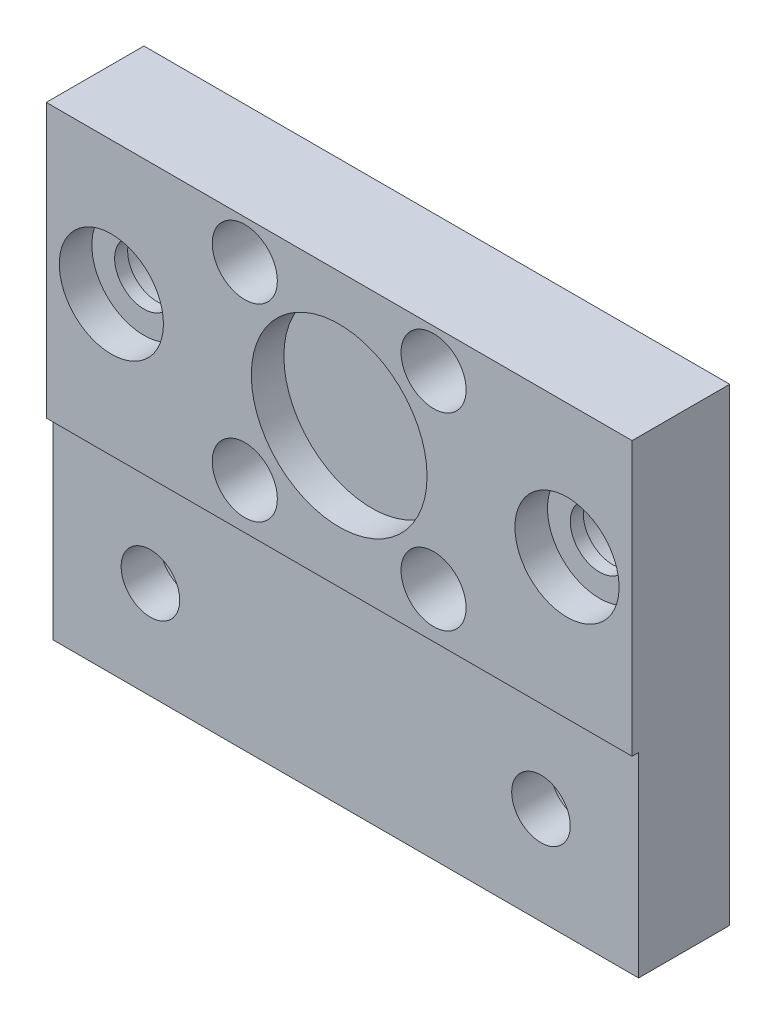
ISO-10303-21;
HEADER;
FILE_DESCRIPTION(('STEP AP214'),'2;1');
FILE_NAME('part.step','',(''),(''),'','','');
FILE_SCHEMA(('AUTOMOTIVE_DESIGN { 1 0 10303 214 1 1 1 1 }'));
ENDSEC;
DATA;
#1=APPLICATION_CONTEXT('core data for automotive mechanical design processes');
#2=APPLICATION_PROTOCOL_DEFINITION('international standard','automotive_design',2000,#1);
#3=PRODUCT_CONTEXT('',#1,'mechanical');
#4=PRODUCT('Part','Part','',(#3));
#5=PRODUCT_RELATED_PRODUCT_CATEGORY('part','',(#4));
#6=PRODUCT_DEFINITION_FORMATION('','',#4);
#7=PRODUCT_DEFINITION_CONTEXT('part definition',#1,'design');
#8=PRODUCT_DEFINITION('design','',#6,#7);
#9=PRODUCT_DEFINITION_SHAPE('','',#8);
#10=(LENGTH_UNIT() NAMED_UNIT(*) SI_UNIT(.MILLI.,.METRE.));
#11=(NAMED_UNIT(*) PLANE_ANGLE_UNIT() SI_UNIT($,.RADIAN.));
#12=(NAMED_UNIT(*) SI_UNIT($,.STERADIAN.) SOLID_ANGLE_UNIT());
#13=UNCERTAINTY_MEASURE_WITH_UNIT(LENGTH_MEASURE(1.E-05),#10,'distance_accuracy_value','');
#14=(GEOMETRIC_REPRESENTATION_CONTEXT(3) GLOBAL_UNCERTAINTY_ASSIGNED_CONTEXT((#13)) GLOBAL_UNIT_ASSIGNED_CONTEXT((#10,
#11,#12)) REPRESENTATION_CONTEXT('',''));
#15=CARTESIAN_POINT('',(0.,0.,0.));
#16=DIRECTION('',(0.,0.,1.));
#17=DIRECTION('',(1.,0.,0.));
#18=AXIS2_PLACEMENT_3D('',#15,#16,#17);
#19=CARTESIAN_POINT('',(45.,-36.,15.));
#20=DIRECTION('',(-1.,0.,0.));
#21=DIRECTION('',(0.,0.,1.));
#22=AXIS2_PLACEMENT_3D('',#19,#20,#21);
#23=PLANE('',#22);
#24=DIRECTION('',(0.,1.,0.));
#25=VECTOR('',#24,1.);
#26=CARTESIAN_POINT('',(45.,-36.,15.));
#27=LINE('',#26,#25);
#28=CARTESIAN_POINT('',(45.,-6.,15.));
#29=VERTEX_POINT('',#28);
#30=CARTESIAN_POINT('',(45.,36.,15.));
#31=VERTEX_POINT('',#30);
#32=EDGE_CURVE('E108',#29,#31,#27,.T.);
#33=ORIENTED_EDGE('',*,*,#32,.F.);
#34=DIRECTION('',(0.,0.,1.));
#35=VECTOR('',#34,1.);
#36=CARTESIAN_POINT('',(45.,-6.,14.));
#37=LINE('',#36,#35);
#38=CARTESIAN_POINT('',(45.,-6.,14.));
#39=VERTEX_POINT('',#38);
#40=EDGE_CURVE('E56',#39,#29,#37,.T.);
#41=ORIENTED_EDGE('',*,*,#40,.F.);
#42=DIRECTION('',(0.,1.,0.));
#43=VECTOR('',#42,1.);
#44=CARTESIAN_POINT('',(45.,-36.,14.));
#45=LINE('',#44,#43);
#46=CARTESIAN_POINT('',(45.,-36.,14.));
#47=VERTEX_POINT('',#46);
#48=EDGE_CURVE('E93',#47,#39,#45,.T.);
#49=ORIENTED_EDGE('',*,*,#48,.F.);
#50=DIRECTION('',(0.,0.,-1.));
#51=VECTOR('',#50,1.);
#52=CARTESIAN_POINT('',(45.,-36.,15.));
#53=LINE('',#52,#51);
#54=CARTESIAN_POINT('',(45.,-36.,0.));
#55=VERTEX_POINT('',#54);
#56=EDGE_CURVE('E85',#47,#55,#53,.T.);
#57=ORIENTED_EDGE('',*,*,#56,.T.);
#58=DIRECTION('',(0.,1.,0.));
#59=VECTOR('',#58,1.);
#60=CARTESIAN_POINT('',(45.,-36.,0.));
#61=LINE('',#60,#59);
#62=CARTESIAN_POINT('',(45.,36.,0.));
#63=VERTEX_POINT('',#62);
#64=EDGE_CURVE('E90',#55,#63,#61,.T.);
#65=ORIENTED_EDGE('',*,*,#64,.T.);
#66=DIRECTION('',(0.,0.,-1.));
#67=VECTOR('',#66,1.);
#68=CARTESIAN_POINT('',(45.,36.,15.));
#69=LINE('',#68,#67);
#70=EDGE_CURVE('E11',#31,#63,#69,.T.);
#71=ORIENTED_EDGE('',*,*,#70,.F.);
#72=EDGE_LOOP('',(#33,#41,#49,#57,#65,#71));
#73=FACE_BOUND('',#72,.T.);
#74=ADVANCED_FACE('F39',(#73),#23,.F.);
#75=CARTESIAN_POINT('',(-45.,36.,15.));
#76=DIRECTION('',(0.,-1.,0.));
#77=DIRECTION('',(0.,0.,-1.));
#78=AXIS2_PLACEMENT_3D('',#75,#76,#77);
#79=PLANE('',#78);
#80=DIRECTION('',(-1.,0.,0.));
#81=VECTOR('',#80,1.);
#82=CARTESIAN_POINT('',(-45.,36.,0.));
#83=LINE('',#82,#81);
#84=CARTESIAN_POINT('',(-45.,36.,0.));
#85=VERTEX_POINT('',#84);
#86=EDGE_CURVE('E112',#63,#85,#83,.T.);
#87=ORIENTED_EDGE('',*,*,#86,.T.);
#88=DIRECTION('',(0.,0.,-1.));
#89=VECTOR('',#88,1.);
#90=CARTESIAN_POINT('',(-45.,36.,15.));
#91=LINE('',#90,#89);
#92=CARTESIAN_POINT('',(-45.,36.,15.));
#93=VERTEX_POINT('',#92);
#94=EDGE_CURVE('E48',#93,#85,#91,.T.);
#95=ORIENTED_EDGE('',*,*,#94,.F.);
#96=DIRECTION('',(-1.,0.,0.));
#97=VECTOR('',#96,1.);
#98=CARTESIAN_POINT('',(-45.,36.,15.));
#99=LINE('',#98,#97);
#100=EDGE_CURVE('E65',#31,#93,#99,.T.);
#101=ORIENTED_EDGE('',*,*,#100,.F.);
#102=ORIENTED_EDGE('',*,*,#70,.T.);
#103=EDGE_LOOP('',(#87,#95,#101,#102));
#104=FACE_BOUND('',#103,.T.);
#105=ADVANCED_FACE('F288',(#104),#79,.F.);
#106=CARTESIAN_POINT('',(-45.,-36.,15.));
#107=DIRECTION('',(1.,0.,0.));
#108=DIRECTION('',(0.,0.,-1.));
#109=AXIS2_PLACEMENT_3D('',#106,#107,#108);
#110=PLANE('',#109);
#111=DIRECTION('',(0.,-1.,0.));
#112=VECTOR('',#111,1.);
#113=CARTESIAN_POINT('',(-45.,-36.,14.));
#114=LINE('',#113,#112);
#115=CARTESIAN_POINT('',(-45.,-6.,14.));
#116=VERTEX_POINT('',#115);
#117=CARTESIAN_POINT('',(-45.,-36.,14.));
#118=VERTEX_POINT('',#117);
#119=EDGE_CURVE('E237',#116,#118,#114,.T.);
#120=ORIENTED_EDGE('',*,*,#119,.F.);
#121=DIRECTION('',(0.,0.,1.));
#122=VECTOR('',#121,1.);
#123=CARTESIAN_POINT('',(-45.,-6.,14.));
#124=LINE('',#123,#122);
#125=CARTESIAN_POINT('',(-45.,-6.,15.));
#126=VERTEX_POINT('',#125);
#127=EDGE_CURVE('E114',#116,#126,#124,.T.);
#128=ORIENTED_EDGE('',*,*,#127,.T.);
#129=DIRECTION('',(0.,-1.,0.));
#130=VECTOR('',#129,1.);
#131=CARTESIAN_POINT('',(-45.,-36.,15.));
#132=LINE('',#131,#130);
#133=EDGE_CURVE('E98',#93,#126,#132,.T.);
#134=ORIENTED_EDGE('',*,*,#133,.F.);
#135=ORIENTED_EDGE('',*,*,#94,.T.);
#136=DIRECTION('',(0.,-1.,0.));
#137=VECTOR('',#136,1.);
#138=CARTESIAN_POINT('',(-45.,-36.,0.));
#139=LINE('',#138,#137);
#140=CARTESIAN_POINT('',(-45.,-36.,0.));
#141=VERTEX_POINT('',#140);
#142=EDGE_CURVE('E109',#85,#141,#139,.T.);
#143=ORIENTED_EDGE('',*,*,#142,.T.);
#144=DIRECTION('',(0.,0.,-1.));
#145=VECTOR('',#144,1.);
#146=CARTESIAN_POINT('',(-45.,-36.,15.));
#147=LINE('',#146,#145);
#148=EDGE_CURVE('E97',#118,#141,#147,.T.);
#149=ORIENTED_EDGE('',*,*,#148,.F.);
#150=EDGE_LOOP('',(#120,#128,#134,#135,#143,#149));
#151=FACE_BOUND('',#150,.T.);
#152=ADVANCED_FACE('F264',(#151),#110,.F.);
#153=CARTESIAN_POINT('',(-45.,-36.,15.));
#154=DIRECTION('',(0.,1.,0.));
#155=DIRECTION('',(0.,0.,1.));
#156=AXIS2_PLACEMENT_3D('',#153,#154,#155);
#157=PLANE('',#156);
#158=ORIENTED_EDGE('',*,*,#56,.F.);
#159=DIRECTION('',(1.,0.,0.));
#160=VECTOR('',#159,1.);
#161=CARTESIAN_POINT('',(-45.,-36.,14.));
#162=LINE('',#161,#160);
#163=EDGE_CURVE('E241',#118,#47,#162,.T.);
#164=ORIENTED_EDGE('',*,*,#163,.F.);
#165=ORIENTED_EDGE('',*,*,#148,.T.);
#166=DIRECTION('',(1.,0.,0.));
#167=VECTOR('',#166,1.);
#168=CARTESIAN_POINT('',(-45.,-36.,0.));
#169=LINE('',#168,#167);
#170=EDGE_CURVE('E101',#141,#55,#169,.T.);
#171=ORIENTED_EDGE('',*,*,#170,.T.);
#172=EDGE_LOOP('',(#158,#164,#165,#171));
#173=FACE_BOUND('',#172,.T.);
#174=ADVANCED_FACE('F102',(#173),#157,.F.);
#175=CARTESIAN_POINT('',(0.,0.,15.));
#176=DIRECTION('',(0.,0.,-1.));
#177=DIRECTION('',(-1.,0.,0.));
#178=AXIS2_PLACEMENT_3D('',#175,#176,#177);
#179=PLANE('',#178);
#180=CARTESIAN_POINT('',(35.,15.4999999999998,15.));
#181=DIRECTION('',(0.,0.,1.));
#182=DIRECTION('',(-1.,0.,0.));
#183=AXIS2_PLACEMENT_3D('',#180,#181,#182);
#184=CIRCLE('',#183,8.);
#185=CARTESIAN_POINT('',(27.,15.4999999999998,15.));
#186=VERTEX_POINT('',#185);
#187=EDGE_CURVE('E135',#186,#186,#184,.T.);
#188=ORIENTED_EDGE('',*,*,#187,.F.);
#189=EDGE_LOOP('',(#188));
#190=FACE_BOUND('',#189,.T.);
#191=CARTESIAN_POINT('',(-35.,15.4999999999998,15.));
#192=DIRECTION('',(0.,0.,1.));
#193=DIRECTION('',(1.,0.,0.));
#194=AXIS2_PLACEMENT_3D('',#191,#192,#193);
#195=CIRCLE('',#194,8.);
#196=CARTESIAN_POINT('',(-27.,15.4999999999998,15.));
#197=VERTEX_POINT('',#196);
#198=EDGE_CURVE('E186',#197,#197,#195,.T.);
#199=ORIENTED_EDGE('',*,*,#198,.F.);
#200=EDGE_LOOP('',(#199));
#201=FACE_BOUND('',#200,.T.);
#202=CARTESIAN_POINT('',(0.,15.4999999999998,15.));
#203=DIRECTION('',(0.,0.,1.));
#204=DIRECTION('',(1.,0.,0.));
#205=AXIS2_PLACEMENT_3D('',#202,#203,#204);
#206=CIRCLE('',#205,13.5);
#207=CARTESIAN_POINT('',(13.5,15.4999999999998,15.));
#208=VERTEX_POINT('',#207);
#209=EDGE_CURVE('E185',#208,#208,#206,.T.);
#210=ORIENTED_EDGE('',*,*,#209,.F.);
#211=EDGE_LOOP('',(#210));
#212=FACE_BOUND('',#211,.T.);
#213=CARTESIAN_POINT('',(-14.5000000000002,0.999999999999836,15.));
#214=DIRECTION('',(0.,0.,1.));
#215=DIRECTION('',(1.,0.,0.));
#216=AXIS2_PLACEMENT_3D('',#213,#214,#215);
#217=CIRCLE('',#216,5.);
#218=CARTESIAN_POINT('',(-9.50000000000015,0.999999999999836,15.));
#219=VERTEX_POINT('',#218);
#220=EDGE_CURVE('E201',#219,#219,#217,.T.);
#221=ORIENTED_EDGE('',*,*,#220,.F.);
#222=EDGE_LOOP('',(#221));
#223=FACE_BOUND('',#222,.T.);
#224=CARTESIAN_POINT('',(14.5,0.999999999999682,15.));
#225=DIRECTION('',(0.,0.,1.));
#226=DIRECTION('',(1.,0.,0.));
#227=AXIS2_PLACEMENT_3D('',#224,#225,#226);
#228=CIRCLE('',#227,5.);
#229=CARTESIAN_POINT('',(19.5,0.999999999999682,15.));
#230=VERTEX_POINT('',#229);
#231=EDGE_CURVE('E218',#230,#230,#228,.T.);
#232=ORIENTED_EDGE('',*,*,#231,.F.);
#233=EDGE_LOOP('',(#232));
#234=FACE_BOUND('',#233,.T.);
#235=CARTESIAN_POINT('',(14.5000000000002,29.9999999999998,15.));
#236=DIRECTION('',(0.,0.,1.));
#237=DIRECTION('',(1.,0.,0.));
#238=AXIS2_PLACEMENT_3D('',#235,#236,#237);
#239=CIRCLE('',#238,5.);
#240=CARTESIAN_POINT('',(19.5000000000002,29.9999999999998,15.));
#241=VERTEX_POINT('',#240);
#242=EDGE_CURVE('E210',#241,#241,#239,.T.);
#243=ORIENTED_EDGE('',*,*,#242,.F.);
#244=EDGE_LOOP('',(#243));
#245=FACE_BOUND('',#244,.T.);
#246=CARTESIAN_POINT('',(-14.5,30.,15.));
#247=DIRECTION('',(0.,0.,1.));
#248=DIRECTION('',(1.,0.,0.));
#249=AXIS2_PLACEMENT_3D('',#246,#247,#248);
#250=CIRCLE('',#249,5.);
#251=CARTESIAN_POINT('',(-9.5,30.,15.));
#252=VERTEX_POINT('',#251);
#253=EDGE_CURVE('E209',#252,#252,#250,.T.);
#254=ORIENTED_EDGE('',*,*,#253,.F.);
#255=EDGE_LOOP('',(#254));
#256=FACE_BOUND('',#255,.T.);
#257=ORIENTED_EDGE('',*,*,#133,.T.);
#258=DIRECTION('',(-1.,0.,0.));
#259=VECTOR('',#258,1.);
#260=CARTESIAN_POINT('',(-45.,-6.,15.));
#261=LINE('',#260,#259);
#262=EDGE_CURVE('E233',#29,#126,#261,.T.);
#263=ORIENTED_EDGE('',*,*,#262,.F.);
#264=ORIENTED_EDGE('',*,*,#32,.T.);
#265=ORIENTED_EDGE('',*,*,#100,.T.);
#266=EDGE_LOOP('',(#257,#263,#264,#265));
#267=FACE_BOUND('',#266,.T.);
#268=ADVANCED_FACE('F260',(#190,#201,#212,#223,#234,#245,#256,#267),#179,.F.);
#269=CARTESIAN_POINT('',(0.,0.,0.));
#270=DIRECTION('',(0.,0.,-1.));
#271=DIRECTION('',(-1.,0.,0.));
#272=AXIS2_PLACEMENT_3D('',#269,#270,#271);
#273=PLANE('',#272);
#274=CARTESIAN_POINT('',(-30.,-20.9999999999999,0.));
#275=DIRECTION('',(0.,0.,-1.));
#276=DIRECTION('',(-1.,0.,0.));
#277=AXIS2_PLACEMENT_3D('',#274,#275,#276);
#278=CIRCLE('',#277,7.5);
#279=CARTESIAN_POINT('',(-37.5,-20.9999999999999,0.));
#280=VERTEX_POINT('',#279);
#281=EDGE_CURVE('E432',#280,#280,#278,.T.);
#282=ORIENTED_EDGE('',*,*,#281,.F.);
#283=EDGE_LOOP('',(#282));
#284=FACE_BOUND('',#283,.T.);
#285=CARTESIAN_POINT('',(30.,-20.9999999999999,0.));
#286=DIRECTION('',(0.,0.,-1.));
#287=DIRECTION('',(-1.,0.,0.));
#288=AXIS2_PLACEMENT_3D('',#285,#286,#287);
#289=CIRCLE('',#288,7.5);
#290=CARTESIAN_POINT('',(22.5,-20.9999999999999,0.));
#291=VERTEX_POINT('',#290);
#292=EDGE_CURVE('E161',#291,#291,#289,.T.);
#293=ORIENTED_EDGE('',*,*,#292,.F.);
#294=EDGE_LOOP('',(#293));
#295=FACE_BOUND('',#294,.T.);
#296=CARTESIAN_POINT('',(35.,15.4999999999998,0.));
#297=DIRECTION('',(0.,0.,-1.));
#298=DIRECTION('',(-1.,0.,0.));
#299=AXIS2_PLACEMENT_3D('',#296,#297,#298);
#300=CIRCLE('',#299,7.5);
#301=CARTESIAN_POINT('',(27.5,15.4999999999998,0.));
#302=VERTEX_POINT('',#301);
#303=EDGE_CURVE('E145',#302,#302,#300,.T.);
#304=ORIENTED_EDGE('',*,*,#303,.F.);
#305=EDGE_LOOP('',(#304));
#306=FACE_BOUND('',#305,.T.);
#307=CARTESIAN_POINT('',(-35.,15.4999999999998,0.));
#308=DIRECTION('',(0.,0.,-1.));
#309=DIRECTION('',(-1.,0.,0.));
#310=AXIS2_PLACEMENT_3D('',#307,#308,#309);
#311=CIRCLE('',#310,7.5);
#312=CARTESIAN_POINT('',(-42.5,15.4999999999998,0.));
#313=VERTEX_POINT('',#312);
#314=EDGE_CURVE('E140',#313,#313,#311,.T.);
#315=ORIENTED_EDGE('',*,*,#314,.F.);
#316=EDGE_LOOP('',(#315));
#317=FACE_BOUND('',#316,.T.);
#318=CARTESIAN_POINT('',(-14.5000000000002,0.999999999999836,0.));
#319=DIRECTION('',(0.,0.,1.));
#320=DIRECTION('',(1.,0.,0.));
#321=AXIS2_PLACEMENT_3D('',#318,#319,#320);
#322=CIRCLE('',#321,5.);
#323=CARTESIAN_POINT('',(-9.50000000000015,0.999999999999836,0.));
#324=VERTEX_POINT('',#323);
#325=EDGE_CURVE('E222',#324,#324,#322,.T.);
#326=ORIENTED_EDGE('',*,*,#325,.T.);
#327=EDGE_LOOP('',(#326));
#328=FACE_BOUND('',#327,.T.);
#329=CARTESIAN_POINT('',(14.5,0.999999999999682,0.));
#330=DIRECTION('',(0.,0.,1.));
#331=DIRECTION('',(1.,0.,0.));
#332=AXIS2_PLACEMENT_3D('',#329,#330,#331);
#333=CIRCLE('',#332,5.);
#334=CARTESIAN_POINT('',(19.5,0.999999999999682,0.));
#335=VERTEX_POINT('',#334);
#336=EDGE_CURVE('E214',#335,#335,#333,.T.);
#337=ORIENTED_EDGE('',*,*,#336,.T.);
#338=EDGE_LOOP('',(#337));
#339=FACE_BOUND('',#338,.T.);
#340=CARTESIAN_POINT('',(14.5000000000002,29.9999999999998,0.));
#341=DIRECTION('',(0.,0.,1.));
#342=DIRECTION('',(1.,0.,0.));
#343=AXIS2_PLACEMENT_3D('',#340,#341,#342);
#344=CIRCLE('',#343,5.);
#345=CARTESIAN_POINT('',(19.5000000000002,29.9999999999998,0.));
#346=VERTEX_POINT('',#345);
#347=EDGE_CURVE('E205',#346,#346,#344,.T.);
#348=ORIENTED_EDGE('',*,*,#347,.T.);
#349=EDGE_LOOP('',(#348));
#350=FACE_BOUND('',#349,.T.);
#351=CARTESIAN_POINT('',(-14.5,30.,0.));
#352=DIRECTION('',(0.,0.,1.));
#353=DIRECTION('',(1.,0.,0.));
#354=AXIS2_PLACEMENT_3D('',#351,#352,#353);
#355=CIRCLE('',#354,5.);
#356=CARTESIAN_POINT('',(-9.5,30.,0.));
#357=VERTEX_POINT('',#356);
#358=EDGE_CURVE('E229',#357,#357,#355,.T.);
#359=ORIENTED_EDGE('',*,*,#358,.T.);
#360=EDGE_LOOP('',(#359));
#361=FACE_BOUND('',#360,.T.);
#362=ORIENTED_EDGE('',*,*,#64,.F.);
#363=ORIENTED_EDGE('',*,*,#170,.F.);
#364=ORIENTED_EDGE('',*,*,#142,.F.);
#365=ORIENTED_EDGE('',*,*,#86,.F.);
#366=EDGE_LOOP('',(#362,#363,#364,#365));
#367=FACE_BOUND('',#366,.T.);
#368=ADVANCED_FACE('F111',(#284,#295,#306,#317,#328,#339,#350,#361,#367),#273,.T.);
#369=CARTESIAN_POINT('',(-45.,-6.,14.));
#370=DIRECTION('',(0.,1.,0.));
#371=DIRECTION('',(0.,0.,1.));
#372=AXIS2_PLACEMENT_3D('',#369,#370,#371);
#373=PLANE('',#372);
#374=ORIENTED_EDGE('',*,*,#262,.T.);
#375=ORIENTED_EDGE('',*,*,#127,.F.);
#376=DIRECTION('',(-1.,0.,0.));
#377=VECTOR('',#376,1.);
#378=CARTESIAN_POINT('',(-45.,-6.,14.));
#379=LINE('',#378,#377);
#380=EDGE_CURVE('E247',#39,#116,#379,.T.);
#381=ORIENTED_EDGE('',*,*,#380,.F.);
#382=ORIENTED_EDGE('',*,*,#40,.T.);
#383=EDGE_LOOP('',(#374,#375,#381,#382));
#384=FACE_BOUND('',#383,.T.);
#385=ADVANCED_FACE('F266',(#384),#373,.F.);
#386=CARTESIAN_POINT('',(0.,0.,14.));
#387=DIRECTION('',(0.,0.,-1.));
#388=DIRECTION('',(-1.,0.,0.));
#389=AXIS2_PLACEMENT_3D('',#386,#387,#388);
#390=PLANE('',#389);
#391=CARTESIAN_POINT('',(-30.,-20.9999999999999,14.));
#392=DIRECTION('',(0.,0.,-1.));
#393=DIRECTION('',(-1.,0.,0.));
#394=AXIS2_PLACEMENT_3D('',#391,#392,#393);
#395=CIRCLE('',#394,4.5);
#396=CARTESIAN_POINT('',(-34.5,-20.9999999999999,14.));
#397=VERTEX_POINT('',#396);
#398=EDGE_CURVE('E42',#397,#397,#395,.T.);
#399=ORIENTED_EDGE('',*,*,#398,.T.);
#400=EDGE_LOOP('',(#399));
#401=FACE_BOUND('',#400,.T.);
#402=CARTESIAN_POINT('',(30.,-20.9999999999999,14.));
#403=DIRECTION('',(0.,0.,-1.));
#404=DIRECTION('',(-1.,0.,0.));
#405=AXIS2_PLACEMENT_3D('',#402,#403,#404);
#406=CIRCLE('',#405,4.49999999999999);
#407=CARTESIAN_POINT('',(25.5,-20.9999999999999,14.));
#408=VERTEX_POINT('',#407);
#409=EDGE_CURVE('E142',#408,#408,#406,.T.);
#410=ORIENTED_EDGE('',*,*,#409,.T.);
#411=EDGE_LOOP('',(#410));
#412=FACE_BOUND('',#411,.T.);
#413=ORIENTED_EDGE('',*,*,#119,.T.);
#414=ORIENTED_EDGE('',*,*,#163,.T.);
#415=ORIENTED_EDGE('',*,*,#48,.T.);
#416=ORIENTED_EDGE('',*,*,#380,.T.);
#417=EDGE_LOOP('',(#413,#414,#415,#416));
#418=FACE_BOUND('',#417,.T.);
#419=ADVANCED_FACE('F270',(#401,#412,#418),#390,.F.);
#420=CARTESIAN_POINT('',(-14.5,30.,0.));
#421=DIRECTION('',(0.,0.,1.));
#422=DIRECTION('',(1.,0.,0.));
#423=AXIS2_PLACEMENT_3D('',#420,#421,#422);
#424=CYLINDRICAL_SURFACE('',#423,5.);
#425=ORIENTED_EDGE('',*,*,#358,.F.);
#426=EDGE_LOOP('',(#425));
#427=FACE_BOUND('',#426,.T.);
#428=ORIENTED_EDGE('',*,*,#253,.T.);
#429=EDGE_LOOP('',(#428));
#430=FACE_BOUND('',#429,.T.);
#431=ADVANCED_FACE('F275',(#427,#430),#424,.F.);
#432=CARTESIAN_POINT('',(14.5000000000002,29.9999999999998,0.));
#433=DIRECTION('',(0.,0.,1.));
#434=DIRECTION('',(1.,0.,0.));
#435=AXIS2_PLACEMENT_3D('',#432,#433,#434);
#436=CYLINDRICAL_SURFACE('',#435,5.);
#437=ORIENTED_EDGE('',*,*,#347,.F.);
#438=EDGE_LOOP('',(#437));
#439=FACE_BOUND('',#438,.T.);
#440=ORIENTED_EDGE('',*,*,#242,.T.);
#441=EDGE_LOOP('',(#440));
#442=FACE_BOUND('',#441,.T.);
#443=ADVANCED_FACE('F282',(#439,#442),#436,.F.);
#444=CARTESIAN_POINT('',(14.5,0.999999999999682,0.));
#445=DIRECTION('',(0.,0.,1.));
#446=DIRECTION('',(1.,0.,0.));
#447=AXIS2_PLACEMENT_3D('',#444,#445,#446);
#448=CYLINDRICAL_SURFACE('',#447,5.);
#449=ORIENTED_EDGE('',*,*,#336,.F.);
#450=EDGE_LOOP('',(#449));
#451=FACE_BOUND('',#450,.T.);
#452=ORIENTED_EDGE('',*,*,#231,.T.);
#453=EDGE_LOOP('',(#452));
#454=FACE_BOUND('',#453,.T.);
#455=ADVANCED_FACE('F323',(#451,#454),#448,.F.);
#456=CARTESIAN_POINT('',(-14.5000000000002,0.999999999999836,0.));
#457=DIRECTION('',(0.,0.,1.));
#458=DIRECTION('',(1.,0.,0.));
#459=AXIS2_PLACEMENT_3D('',#456,#457,#458);
#460=CYLINDRICAL_SURFACE('',#459,5.);
#461=ORIENTED_EDGE('',*,*,#325,.F.);
#462=EDGE_LOOP('',(#461));
#463=FACE_BOUND('',#462,.T.);
#464=ORIENTED_EDGE('',*,*,#220,.T.);
#465=EDGE_LOOP('',(#464));
#466=FACE_BOUND('',#465,.T.);
#467=ADVANCED_FACE('F329',(#463,#466),#460,.F.);
#468=CARTESIAN_POINT('',(0.,15.4999999999998,10.));
#469=DIRECTION('',(0.,0.,1.));
#470=DIRECTION('',(1.,0.,0.));
#471=AXIS2_PLACEMENT_3D('',#468,#469,#470);
#472=CYLINDRICAL_SURFACE('',#471,13.5);
#473=CARTESIAN_POINT('',(0.,15.4999999999998,10.));
#474=DIRECTION('',(0.,0.,1.));
#475=DIRECTION('',(1.,0.,0.));
#476=AXIS2_PLACEMENT_3D('',#473,#474,#475);
#477=CIRCLE('',#476,13.5);
#478=CARTESIAN_POINT('',(13.5,15.4999999999998,10.));
#479=VERTEX_POINT('',#478);
#480=EDGE_CURVE('E197',#479,#479,#477,.T.);
#481=ORIENTED_EDGE('',*,*,#480,.F.);
#482=EDGE_LOOP('',(#481));
#483=FACE_BOUND('',#482,.T.);
#484=ORIENTED_EDGE('',*,*,#209,.T.);
#485=EDGE_LOOP('',(#484));
#486=FACE_BOUND('',#485,.T.);
#487=ADVANCED_FACE('F334',(#483,#486),#472,.F.);
#488=CARTESIAN_POINT('',(0.,15.4999999999998,10.));
#489=DIRECTION('',(0.,0.,1.));
#490=DIRECTION('',(1.,0.,0.));
#491=AXIS2_PLACEMENT_3D('',#488,#489,#490);
#492=PLANE('',#491);
#493=ORIENTED_EDGE('',*,*,#480,.T.);
#494=EDGE_LOOP('',(#493));
#495=FACE_BOUND('',#494,.T.);
#496=ADVANCED_FACE('F342',(#495),#492,.T.);
#497=CARTESIAN_POINT('',(-35.,15.4999999999998,10.));
#498=DIRECTION('',(0.,0.,1.));
#499=DIRECTION('',(1.,0.,0.));
#500=AXIS2_PLACEMENT_3D('',#497,#498,#499);
#501=CYLINDRICAL_SURFACE('',#500,8.);
#502=CARTESIAN_POINT('',(-35.,15.4999999999998,10.));
#503=DIRECTION('',(0.,0.,1.));
#504=DIRECTION('',(1.,0.,0.));
#505=AXIS2_PLACEMENT_3D('',#502,#503,#504);
#506=CIRCLE('',#505,8.);
#507=CARTESIAN_POINT('',(-27.,15.4999999999998,10.));
#508=VERTEX_POINT('',#507);
#509=EDGE_CURVE('E181',#508,#508,#506,.T.);
#510=ORIENTED_EDGE('',*,*,#509,.F.);
#511=EDGE_LOOP('',(#510));
#512=FACE_BOUND('',#511,.T.);
#513=ORIENTED_EDGE('',*,*,#198,.T.);
#514=EDGE_LOOP('',(#513));
#515=FACE_BOUND('',#514,.T.);
#516=ADVANCED_FACE('F356',(#512,#515),#501,.F.);
#517=CARTESIAN_POINT('',(-35.,15.4999999999998,10.));
#518=DIRECTION('',(0.,0.,1.));
#519=DIRECTION('',(1.,0.,0.));
#520=AXIS2_PLACEMENT_3D('',#517,#518,#519);
#521=PLANE('',#520);
#522=CARTESIAN_POINT('',(-35.,15.4999999999998,10.));
#523=DIRECTION('',(0.,0.,1.));
#524=DIRECTION('',(1.,0.,0.));
#525=AXIS2_PLACEMENT_3D('',#522,#523,#524);
#526=CIRCLE('',#525,4.5);
#527=CARTESIAN_POINT('',(-30.5,15.4999999999998,10.));
#528=VERTEX_POINT('',#527);
#529=EDGE_CURVE('E131',#528,#528,#526,.T.);
#530=ORIENTED_EDGE('',*,*,#529,.F.);
#531=EDGE_LOOP('',(#530));
#532=FACE_BOUND('',#531,.T.);
#533=ORIENTED_EDGE('',*,*,#509,.T.);
#534=EDGE_LOOP('',(#533));
#535=FACE_BOUND('',#534,.T.);
#536=ADVANCED_FACE('F363',(#532,#535),#521,.T.);
#537=CARTESIAN_POINT('',(35.,15.4999999999998,10.));
#538=DIRECTION('',(0.,0.,1.));
#539=DIRECTION('',(1.,0.,0.));
#540=AXIS2_PLACEMENT_3D('',#537,#538,#539);
#541=CYLINDRICAL_SURFACE('',#540,8.);
#542=CARTESIAN_POINT('',(35.,15.4999999999998,10.));
#543=DIRECTION('',(0.,0.,1.));
#544=DIRECTION('',(-1.,0.,0.));
#545=AXIS2_PLACEMENT_3D('',#542,#543,#544);
#546=CIRCLE('',#545,8.);
#547=CARTESIAN_POINT('',(27.,15.4999999999998,10.));
#548=VERTEX_POINT('',#547);
#549=EDGE_CURVE('E190',#548,#548,#546,.T.);
#550=ORIENTED_EDGE('',*,*,#549,.F.);
#551=EDGE_LOOP('',(#550));
#552=FACE_BOUND('',#551,.T.);
#553=ORIENTED_EDGE('',*,*,#187,.T.);
#554=EDGE_LOOP('',(#553));
#555=FACE_BOUND('',#554,.T.);
#556=ADVANCED_FACE('F367',(#552,#555),#541,.F.);
#557=CARTESIAN_POINT('',(35.,15.4999999999998,10.));
#558=DIRECTION('',(0.,0.,-1.));
#559=DIRECTION('',(-1.,0.,0.));
#560=AXIS2_PLACEMENT_3D('',#557,#558,#559);
#561=PLANE('',#560);
#562=CARTESIAN_POINT('',(35.,15.4999999999998,10.));
#563=DIRECTION('',(0.,0.,-1.));
#564=DIRECTION('',(-1.,0.,0.));
#565=AXIS2_PLACEMENT_3D('',#562,#563,#564);
#566=CIRCLE('',#565,4.49999999999999);
#567=CARTESIAN_POINT('',(30.5,15.4999999999998,10.));
#568=VERTEX_POINT('',#567);
#569=EDGE_CURVE('E137',#568,#568,#566,.T.);
#570=ORIENTED_EDGE('',*,*,#569,.T.);
#571=EDGE_LOOP('',(#570));
#572=FACE_BOUND('',#571,.T.);
#573=ORIENTED_EDGE('',*,*,#549,.T.);
#574=EDGE_LOOP('',(#573));
#575=FACE_BOUND('',#574,.T.);
#576=ADVANCED_FACE('F370',(#572,#575),#561,.F.);
#577=CARTESIAN_POINT('',(-35.,15.4999999999998,0.));
#578=DIRECTION('',(0.,0.,-1.));
#579=DIRECTION('',(-1.,0.,0.));
#580=AXIS2_PLACEMENT_3D('',#577,#578,#579);
#581=CYLINDRICAL_SURFACE('',#580,4.5);
#582=ORIENTED_EDGE('',*,*,#529,.T.);
#583=EDGE_LOOP('',(#582));
#584=FACE_BOUND('',#583,.T.);
#585=CARTESIAN_POINT('',(-35.,15.4999999999998,8.));
#586=DIRECTION('',(0.,0.,-1.));
#587=DIRECTION('',(-1.,0.,0.));
#588=AXIS2_PLACEMENT_3D('',#585,#586,#587);
#589=CIRCLE('',#588,4.5);
#590=CARTESIAN_POINT('',(-39.5,15.4999999999998,8.));
#591=VERTEX_POINT('',#590);
#592=EDGE_CURVE('E136',#591,#591,#589,.T.);
#593=ORIENTED_EDGE('',*,*,#592,.T.);
#594=EDGE_LOOP('',(#593));
#595=FACE_BOUND('',#594,.T.);
#596=ADVANCED_FACE('F373',(#584,#595),#581,.F.);
#597=CARTESIAN_POINT('',(-30.5,15.4999999999998,8.));
#598=DIRECTION('',(0.,0.,1.));
#599=DIRECTION('',(1.,0.,0.));
#600=AXIS2_PLACEMENT_3D('',#597,#598,#599);
#601=PLANE('',#600);
#602=ORIENTED_EDGE('',*,*,#592,.F.);
#603=EDGE_LOOP('',(#602));
#604=FACE_BOUND('',#603,.T.);
#605=CARTESIAN_POINT('',(-35.,15.4999999999998,8.));
#606=DIRECTION('',(0.,0.,-1.));
#607=DIRECTION('',(-1.,0.,0.));
#608=AXIS2_PLACEMENT_3D('',#605,#606,#607);
#609=CIRCLE('',#608,7.5);
#610=CARTESIAN_POINT('',(-42.5,15.4999999999998,8.));
#611=VERTEX_POINT('',#610);
#612=EDGE_CURVE('E174',#611,#611,#609,.T.);
#613=ORIENTED_EDGE('',*,*,#612,.T.);
#614=EDGE_LOOP('',(#613));
#615=FACE_BOUND('',#614,.T.);
#616=ADVANCED_FACE('F381',(#604,#615),#601,.F.);
#617=CARTESIAN_POINT('',(-35.,15.4999999999998,0.));
#618=DIRECTION('',(0.,0.,-1.));
#619=DIRECTION('',(-1.,0.,0.));
#620=AXIS2_PLACEMENT_3D('',#617,#618,#619);
#621=CYLINDRICAL_SURFACE('',#620,7.5);
#622=ORIENTED_EDGE('',*,*,#612,.F.);
#623=EDGE_LOOP('',(#622));
#624=FACE_BOUND('',#623,.T.);
#625=ORIENTED_EDGE('',*,*,#314,.T.);
#626=EDGE_LOOP('',(#625));
#627=FACE_BOUND('',#626,.T.);
#628=ADVANCED_FACE('F385',(#624,#627),#621,.F.);
#629=CARTESIAN_POINT('',(35.,15.4999999999998,0.));
#630=DIRECTION('',(0.,0.,-1.));
#631=DIRECTION('',(-1.,0.,0.));
#632=AXIS2_PLACEMENT_3D('',#629,#630,#631);
#633=CYLINDRICAL_SURFACE('',#632,4.49999999999999);
#634=CARTESIAN_POINT('',(35.,15.4999999999998,8.));
#635=DIRECTION('',(0.,0.,-1.));
#636=DIRECTION('',(-1.,0.,0.));
#637=AXIS2_PLACEMENT_3D('',#634,#635,#636);
#638=CIRCLE('',#637,4.5);
#639=CARTESIAN_POINT('',(30.5,15.4999999999998,8.));
#640=VERTEX_POINT('',#639);
#641=EDGE_CURVE('E141',#640,#640,#638,.T.);
#642=ORIENTED_EDGE('',*,*,#641,.T.);
#643=EDGE_LOOP('',(#642));
#644=FACE_BOUND('',#643,.T.);
#645=ORIENTED_EDGE('',*,*,#569,.F.);
#646=EDGE_LOOP('',(#645));
#647=FACE_BOUND('',#646,.T.);
#648=ADVANCED_FACE('F389',(#644,#647),#633,.F.);
#649=CARTESIAN_POINT('',(39.5,15.4999999999998,8.));
#650=DIRECTION('',(0.,0.,1.));
#651=DIRECTION('',(1.,0.,0.));
#652=AXIS2_PLACEMENT_3D('',#649,#650,#651);
#653=PLANE('',#652);
#654=ORIENTED_EDGE('',*,*,#641,.F.);
#655=EDGE_LOOP('',(#654));
#656=FACE_BOUND('',#655,.T.);
#657=CARTESIAN_POINT('',(35.,15.4999999999998,8.));
#658=DIRECTION('',(0.,0.,-1.));
#659=DIRECTION('',(-1.,0.,0.));
#660=AXIS2_PLACEMENT_3D('',#657,#658,#659);
#661=CIRCLE('',#660,7.5);
#662=CARTESIAN_POINT('',(27.5,15.4999999999998,8.));
#663=VERTEX_POINT('',#662);
#664=EDGE_CURVE('E152',#663,#663,#661,.T.);
#665=ORIENTED_EDGE('',*,*,#664,.T.);
#666=EDGE_LOOP('',(#665));
#667=FACE_BOUND('',#666,.T.);
#668=ADVANCED_FACE('F393',(#656,#667),#653,.F.);
#669=CARTESIAN_POINT('',(35.,15.4999999999998,0.));
#670=DIRECTION('',(0.,0.,-1.));
#671=DIRECTION('',(-1.,0.,0.));
#672=AXIS2_PLACEMENT_3D('',#669,#670,#671);
#673=CYLINDRICAL_SURFACE('',#672,7.5);
#674=ORIENTED_EDGE('',*,*,#664,.F.);
#675=EDGE_LOOP('',(#674));
#676=FACE_BOUND('',#675,.T.);
#677=ORIENTED_EDGE('',*,*,#303,.T.);
#678=EDGE_LOOP('',(#677));
#679=FACE_BOUND('',#678,.T.);
#680=ADVANCED_FACE('F397',(#676,#679),#673,.F.);
#681=CARTESIAN_POINT('',(30.,-20.9999999999999,0.));
#682=DIRECTION('',(0.,0.,-1.));
#683=DIRECTION('',(-1.,0.,0.));
#684=AXIS2_PLACEMENT_3D('',#681,#682,#683);
#685=CYLINDRICAL_SURFACE('',#684,4.49999999999999);
#686=CARTESIAN_POINT('',(30.,-20.9999999999999,8.));
#687=DIRECTION('',(0.,0.,-1.));
#688=DIRECTION('',(-1.,0.,0.));
#689=AXIS2_PLACEMENT_3D('',#686,#687,#688);
#690=CIRCLE('',#689,4.5);
#691=CARTESIAN_POINT('',(25.5,-20.9999999999999,8.));
#692=VERTEX_POINT('',#691);
#693=EDGE_CURVE('E146',#692,#692,#690,.T.);
#694=ORIENTED_EDGE('',*,*,#693,.T.);
#695=EDGE_LOOP('',(#694));
#696=FACE_BOUND('',#695,.T.);
#697=ORIENTED_EDGE('',*,*,#409,.F.);
#698=EDGE_LOOP('',(#697));
#699=FACE_BOUND('',#698,.T.);
#700=ADVANCED_FACE('F401',(#696,#699),#685,.F.);
#701=CARTESIAN_POINT('',(34.5,-20.9999999999999,8.));
#702=DIRECTION('',(0.,0.,1.));
#703=DIRECTION('',(1.,0.,0.));
#704=AXIS2_PLACEMENT_3D('',#701,#702,#703);
#705=PLANE('',#704);
#706=ORIENTED_EDGE('',*,*,#693,.F.);
#707=EDGE_LOOP('',(#706));
#708=FACE_BOUND('',#707,.T.);
#709=CARTESIAN_POINT('',(30.,-20.9999999999999,8.));
#710=DIRECTION('',(0.,0.,-1.));
#711=DIRECTION('',(-1.,0.,0.));
#712=AXIS2_PLACEMENT_3D('',#709,#710,#711);
#713=CIRCLE('',#712,7.5);
#714=CARTESIAN_POINT('',(22.5,-20.9999999999999,8.));
#715=VERTEX_POINT('',#714);
#716=EDGE_CURVE('E155',#715,#715,#713,.T.);
#717=ORIENTED_EDGE('',*,*,#716,.T.);
#718=EDGE_LOOP('',(#717));
#719=FACE_BOUND('',#718,.T.);
#720=ADVANCED_FACE('F405',(#708,#719),#705,.F.);
#721=CARTESIAN_POINT('',(30.,-20.9999999999999,0.));
#722=DIRECTION('',(0.,0.,-1.));
#723=DIRECTION('',(-1.,0.,0.));
#724=AXIS2_PLACEMENT_3D('',#721,#722,#723);
#725=CYLINDRICAL_SURFACE('',#724,7.5);
#726=ORIENTED_EDGE('',*,*,#716,.F.);
#727=EDGE_LOOP('',(#726));
#728=FACE_BOUND('',#727,.T.);
#729=ORIENTED_EDGE('',*,*,#292,.T.);
#730=EDGE_LOOP('',(#729));
#731=FACE_BOUND('',#730,.T.);
#732=ADVANCED_FACE('F408',(#728,#731),#725,.F.);
#733=CARTESIAN_POINT('',(-30.,-20.9999999999999,0.));
#734=DIRECTION('',(0.,0.,-1.));
#735=DIRECTION('',(-1.,0.,0.));
#736=AXIS2_PLACEMENT_3D('',#733,#734,#735);
#737=CYLINDRICAL_SURFACE('',#736,4.5);
#738=CARTESIAN_POINT('',(-30.,-20.9999999999999,8.));
#739=DIRECTION('',(0.,0.,-1.));
#740=DIRECTION('',(-1.,0.,0.));
#741=AXIS2_PLACEMENT_3D('',#738,#739,#740);
#742=CIRCLE('',#741,4.5);
#743=CARTESIAN_POINT('',(-34.5,-20.9999999999999,8.));
#744=VERTEX_POINT('',#743);
#745=EDGE_CURVE('E436',#744,#744,#742,.T.);
#746=ORIENTED_EDGE('',*,*,#745,.T.);
#747=EDGE_LOOP('',(#746));
#748=FACE_BOUND('',#747,.T.);
#749=ORIENTED_EDGE('',*,*,#398,.F.);
#750=EDGE_LOOP('',(#749));
#751=FACE_BOUND('',#750,.T.);
#752=ADVANCED_FACE('F412',(#748,#751),#737,.F.);
#753=CARTESIAN_POINT('',(-25.5,-20.9999999999999,8.));
#754=DIRECTION('',(0.,0.,1.));
#755=DIRECTION('',(1.,0.,0.));
#756=AXIS2_PLACEMENT_3D('',#753,#754,#755);
#757=PLANE('',#756);
#758=ORIENTED_EDGE('',*,*,#745,.F.);
#759=EDGE_LOOP('',(#758));
#760=FACE_BOUND('',#759,.T.);
#761=CARTESIAN_POINT('',(-30.,-20.9999999999999,8.));
#762=DIRECTION('',(0.,0.,-1.));
#763=DIRECTION('',(-1.,0.,0.));
#764=AXIS2_PLACEMENT_3D('',#761,#762,#763);
#765=CIRCLE('',#764,7.5);
#766=CARTESIAN_POINT('',(-37.5,-20.9999999999999,8.));
#767=VERTEX_POINT('',#766);
#768=EDGE_CURVE('E429',#767,#767,#765,.T.);
#769=ORIENTED_EDGE('',*,*,#768,.T.);
#770=EDGE_LOOP('',(#769));
#771=FACE_BOUND('',#770,.T.);
#772=ADVANCED_FACE('F416',(#760,#771),#757,.F.);
#773=CARTESIAN_POINT('',(-30.,-20.9999999999999,0.));
#774=DIRECTION('',(0.,0.,-1.));
#775=DIRECTION('',(-1.,0.,0.));
#776=AXIS2_PLACEMENT_3D('',#773,#774,#775);
#777=CYLINDRICAL_SURFACE('',#776,7.5);
#778=ORIENTED_EDGE('',*,*,#768,.F.);
#779=EDGE_LOOP('',(#778));
#780=FACE_BOUND('',#779,.T.);
#781=ORIENTED_EDGE('',*,*,#281,.T.);
#782=EDGE_LOOP('',(#781));
#783=FACE_BOUND('',#782,.T.);
#784=ADVANCED_FACE('F420',(#780,#783),#777,.F.);
#785=CLOSED_SHELL('',(#74,#105,#152,#174,#268,#368,#385,#419,#431,#443,#455,#467,#487,#496,#516,
#536,#556,#576,#596,#616,#628,#648,#668,#680,#700,#720,#732,#752,#772,#784));
#786=MANIFOLD_SOLID_BREP('B2',#785);
#787=ADVANCED_BREP_SHAPE_REPRESENTATION('',(#18,#786),#14);
#788=SHAPE_DEFINITION_REPRESENTATION(#9,#787);
ENDSEC;
END-ISO-10303-21;
